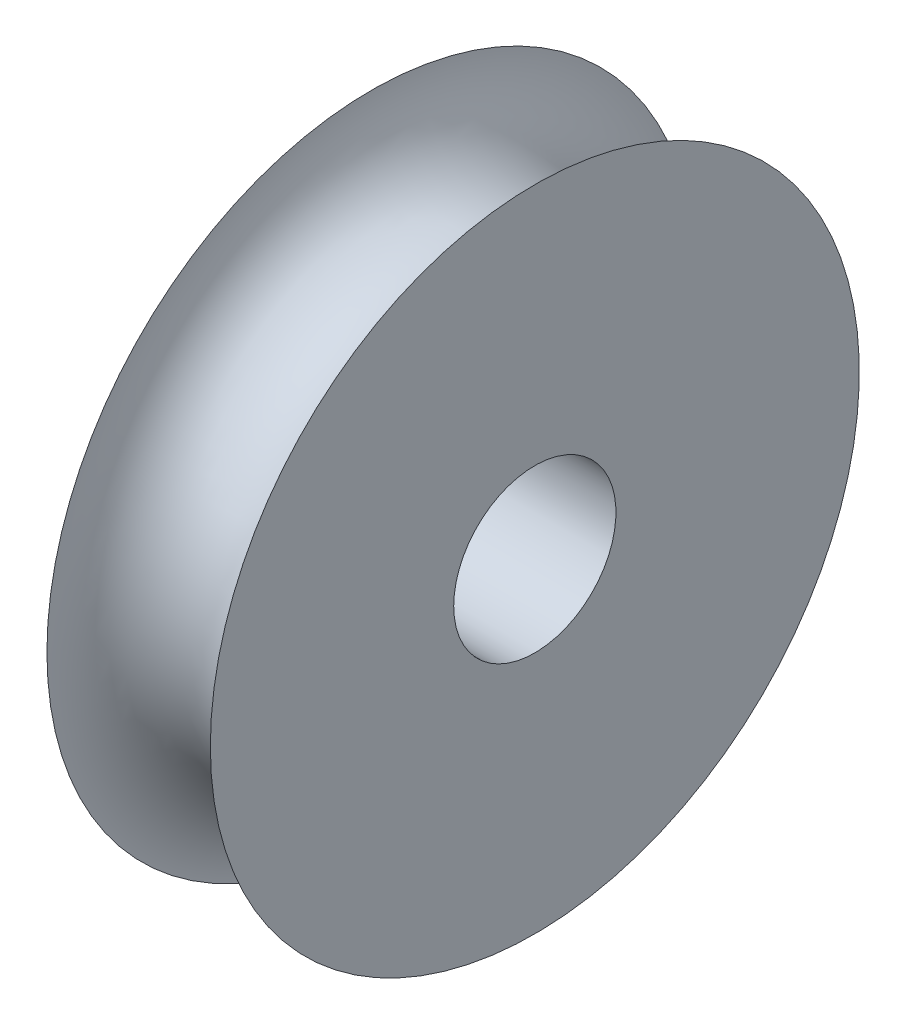
ISO-10303-21;
HEADER;
FILE_DESCRIPTION(('STEP AP214'),'2;1');
FILE_NAME('part.step','',(''),(''),'','','');
FILE_SCHEMA(('AUTOMOTIVE_DESIGN { 1 0 10303 214 1 1 1 1 }'));
ENDSEC;
DATA;
#1=APPLICATION_CONTEXT('core data for automotive mechanical design processes');
#2=APPLICATION_PROTOCOL_DEFINITION('international standard','automotive_design',2000,#1);
#3=PRODUCT_CONTEXT('',#1,'mechanical');
#4=PRODUCT('Part','Part','',(#3));
#5=PRODUCT_RELATED_PRODUCT_CATEGORY('part','',(#4));
#6=PRODUCT_DEFINITION_FORMATION('','',#4);
#7=PRODUCT_DEFINITION_CONTEXT('part definition',#1,'design');
#8=PRODUCT_DEFINITION('design','',#6,#7);
#9=PRODUCT_DEFINITION_SHAPE('','',#8);
#10=(LENGTH_UNIT() NAMED_UNIT(*) SI_UNIT(.MILLI.,.METRE.));
#11=(NAMED_UNIT(*) PLANE_ANGLE_UNIT() SI_UNIT($,.RADIAN.));
#12=(NAMED_UNIT(*) SI_UNIT($,.STERADIAN.) SOLID_ANGLE_UNIT());
#13=UNCERTAINTY_MEASURE_WITH_UNIT(LENGTH_MEASURE(1.E-05),#10,'distance_accuracy_value','');
#14=(GEOMETRIC_REPRESENTATION_CONTEXT(3) GLOBAL_UNCERTAINTY_ASSIGNED_CONTEXT((#13)) GLOBAL_UNIT_ASSIGNED_CONTEXT((#10,
#11,#12)) REPRESENTATION_CONTEXT('',''));
#15=CARTESIAN_POINT('',(0.,0.,0.));
#16=DIRECTION('',(0.,0.,1.));
#17=DIRECTION('',(1.,0.,0.));
#18=AXIS2_PLACEMENT_3D('',#15,#16,#17);
#19=CARTESIAN_POINT('',(6.39564008774604,0.,0.));
#20=DIRECTION('',(-1.,0.,0.));
#21=DIRECTION('',(0.,0.,1.));
#22=AXIS2_PLACEMENT_3D('',#19,#20,#21);
#23=TOROIDAL_SURFACE('',#22,25.4,6.39564008774604);
#24=CARTESIAN_POINT('',(0.,0.,0.));
#25=DIRECTION('',(-1.,0.,0.));
#26=DIRECTION('',(0.,0.,1.));
#27=AXIS2_PLACEMENT_3D('',#24,#25,#26);
#28=CIRCLE('',#27,25.4);
#29=CARTESIAN_POINT('',(0.,0.,25.4));
#30=VERTEX_POINT('',#29);
#31=EDGE_CURVE('E10',#30,#30,#28,.T.);
#32=ORIENTED_EDGE('',*,*,#31,.F.);
#33=EDGE_LOOP('',(#32));
#34=FACE_BOUND('',#33,.T.);
#35=CARTESIAN_POINT('',(12.7912801754921,0.,0.));
#36=DIRECTION('',(-1.,0.,0.));
#37=DIRECTION('',(0.,0.,1.));
#38=AXIS2_PLACEMENT_3D('',#35,#36,#37);
#39=CIRCLE('',#38,25.4);
#40=CARTESIAN_POINT('',(12.7912801754921,0.,25.4));
#41=VERTEX_POINT('',#40);
#42=EDGE_CURVE('E44',#41,#41,#39,.T.);
#43=ORIENTED_EDGE('',*,*,#42,.T.);
#44=EDGE_LOOP('',(#43));
#45=FACE_BOUND('',#44,.T.);
#46=ADVANCED_FACE('F30',(#34,#45),#23,.F.);
#47=CARTESIAN_POINT('',(0.,25.4,0.));
#48=DIRECTION('',(1.,0.,0.));
#49=DIRECTION('',(0.,0.,-1.));
#50=AXIS2_PLACEMENT_3D('',#47,#48,#49);
#51=PLANE('',#50);
#52=CARTESIAN_POINT('',(0.,0.,0.));
#53=DIRECTION('',(-1.,0.,0.));
#54=DIRECTION('',(0.,0.,1.));
#55=AXIS2_PLACEMENT_3D('',#52,#53,#54);
#56=CIRCLE('',#55,6.35);
#57=CARTESIAN_POINT('',(0.,0.,6.35));
#58=VERTEX_POINT('',#57);
#59=EDGE_CURVE('E36',#58,#58,#56,.T.);
#60=ORIENTED_EDGE('',*,*,#59,.F.);
#61=EDGE_LOOP('',(#60));
#62=FACE_BOUND('',#61,.T.);
#63=ORIENTED_EDGE('',*,*,#31,.T.);
#64=EDGE_LOOP('',(#63));
#65=FACE_BOUND('',#64,.T.);
#66=ADVANCED_FACE('F59',(#62,#65),#51,.F.);
#67=CARTESIAN_POINT('',(0.,0.,0.));
#68=DIRECTION('',(-1.,0.,0.));
#69=DIRECTION('',(0.,0.,1.));
#70=AXIS2_PLACEMENT_3D('',#67,#68,#69);
#71=CYLINDRICAL_SURFACE('',#70,6.35);
#72=CARTESIAN_POINT('',(12.7912801754921,0.,0.));
#73=DIRECTION('',(-1.,0.,0.));
#74=DIRECTION('',(0.,0.,1.));
#75=AXIS2_PLACEMENT_3D('',#72,#73,#74);
#76=CIRCLE('',#75,6.35);
#77=CARTESIAN_POINT('',(12.7912801754921,0.,6.35));
#78=VERTEX_POINT('',#77);
#79=EDGE_CURVE('E40',#78,#78,#76,.T.);
#80=ORIENTED_EDGE('',*,*,#79,.F.);
#81=EDGE_LOOP('',(#80));
#82=FACE_BOUND('',#81,.T.);
#83=ORIENTED_EDGE('',*,*,#59,.T.);
#84=EDGE_LOOP('',(#83));
#85=FACE_BOUND('',#84,.T.);
#86=ADVANCED_FACE('F54',(#82,#85),#71,.F.);
#87=CARTESIAN_POINT('',(12.7912801754921,25.4,0.));
#88=DIRECTION('',(-1.,0.,0.));
#89=DIRECTION('',(0.,0.,1.));
#90=AXIS2_PLACEMENT_3D('',#87,#88,#89);
#91=PLANE('',#90);
#92=ORIENTED_EDGE('',*,*,#42,.F.);
#93=EDGE_LOOP('',(#92));
#94=FACE_BOUND('',#93,.T.);
#95=ORIENTED_EDGE('',*,*,#79,.T.);
#96=EDGE_LOOP('',(#95));
#97=FACE_BOUND('',#96,.T.);
#98=ADVANCED_FACE('F51',(#94,#97),#91,.F.);
#99=CLOSED_SHELL('',(#46,#66,#86,#98));
#100=MANIFOLD_SOLID_BREP('B2',#99);
#101=ADVANCED_BREP_SHAPE_REPRESENTATION('',(#18,#100),#14);
#102=SHAPE_DEFINITION_REPRESENTATION(#9,#101);
ENDSEC;
END-ISO-10303-21;
